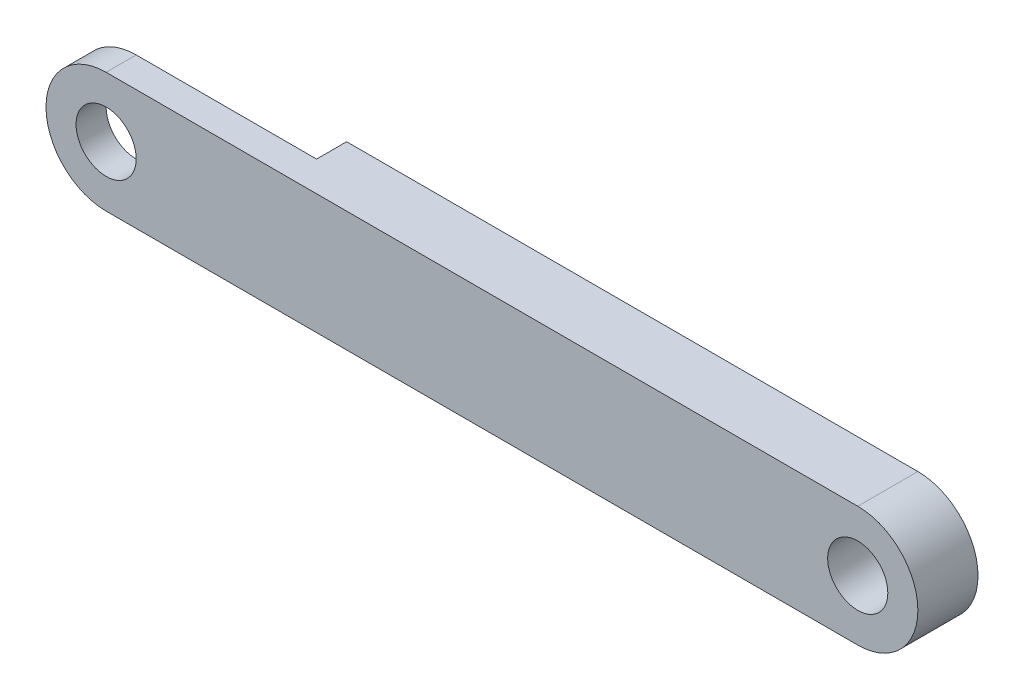
ISO-10303-21;
HEADER;
FILE_DESCRIPTION(('STEP AP214'),'2;1');
FILE_NAME('part.step','',(''),(''),'','','');
FILE_SCHEMA(('AUTOMOTIVE_DESIGN { 1 0 10303 214 1 1 1 1 }'));
ENDSEC;
DATA;
#1=APPLICATION_CONTEXT('core data for automotive mechanical design processes');
#2=APPLICATION_PROTOCOL_DEFINITION('international standard','automotive_design',2000,#1);
#3=PRODUCT_CONTEXT('',#1,'mechanical');
#4=PRODUCT('Part','Part','',(#3));
#5=PRODUCT_RELATED_PRODUCT_CATEGORY('part','',(#4));
#6=PRODUCT_DEFINITION_FORMATION('','',#4);
#7=PRODUCT_DEFINITION_CONTEXT('part definition',#1,'design');
#8=PRODUCT_DEFINITION('design','',#6,#7);
#9=PRODUCT_DEFINITION_SHAPE('','',#8);
#10=(LENGTH_UNIT() NAMED_UNIT(*) SI_UNIT(.MILLI.,.METRE.));
#11=(NAMED_UNIT(*) PLANE_ANGLE_UNIT() SI_UNIT($,.RADIAN.));
#12=(NAMED_UNIT(*) SI_UNIT($,.STERADIAN.) SOLID_ANGLE_UNIT());
#13=UNCERTAINTY_MEASURE_WITH_UNIT(LENGTH_MEASURE(1.E-05),#10,'distance_accuracy_value','');
#14=(GEOMETRIC_REPRESENTATION_CONTEXT(3) GLOBAL_UNCERTAINTY_ASSIGNED_CONTEXT((#13)) GLOBAL_UNIT_ASSIGNED_CONTEXT((#10,
#11,#12)) REPRESENTATION_CONTEXT('',''));
#15=CARTESIAN_POINT('',(0.,0.,0.));
#16=DIRECTION('',(0.,0.,1.));
#17=DIRECTION('',(1.,0.,0.));
#18=AXIS2_PLACEMENT_3D('',#15,#16,#17);
#19=CARTESIAN_POINT('',(0.,0.,5.));
#20=DIRECTION('',(0.,0.,-1.));
#21=DIRECTION('',(-1.,0.,0.));
#22=AXIS2_PLACEMENT_3D('',#19,#20,#21);
#23=CYLINDRICAL_SURFACE('',#22,10.);
#24=CARTESIAN_POINT('',(0.,0.,0.));
#25=DIRECTION('',(0.,0.,-1.));
#26=DIRECTION('',(-1.,0.,0.));
#27=AXIS2_PLACEMENT_3D('',#24,#25,#26);
#28=CIRCLE('',#27,10.);
#29=CARTESIAN_POINT('',(0.,-10.,0.));
#30=VERTEX_POINT('',#29);
#31=CARTESIAN_POINT('',(0.,10.,0.));
#32=VERTEX_POINT('',#31);
#33=EDGE_CURVE('E48',#30,#32,#28,.T.);
#34=ORIENTED_EDGE('',*,*,#33,.F.);
#35=DIRECTION('',(0.,0.,-1.));
#36=VECTOR('',#35,1.);
#37=CARTESIAN_POINT('',(0.,-10.,5.));
#38=LINE('',#37,#36);
#39=CARTESIAN_POINT('',(0.,-10.,5.));
#40=VERTEX_POINT('',#39);
#41=EDGE_CURVE('E11',#40,#30,#38,.T.);
#42=ORIENTED_EDGE('',*,*,#41,.F.);
#43=CARTESIAN_POINT('',(0.,0.,5.));
#44=DIRECTION('',(0.,0.,1.));
#45=DIRECTION('',(1.,0.,0.));
#46=AXIS2_PLACEMENT_3D('',#43,#44,#45);
#47=CIRCLE('',#46,10.);
#48=CARTESIAN_POINT('',(0.,10.,5.));
#49=VERTEX_POINT('',#48);
#50=EDGE_CURVE('E118',#49,#40,#47,.T.);
#51=ORIENTED_EDGE('',*,*,#50,.F.);
#52=DIRECTION('',(0.,0.,-1.));
#53=VECTOR('',#52,1.);
#54=CARTESIAN_POINT('',(0.,10.,5.));
#55=LINE('',#54,#53);
#56=EDGE_CURVE('E124',#49,#32,#55,.T.);
#57=ORIENTED_EDGE('',*,*,#56,.T.);
#58=EDGE_LOOP('',(#34,#42,#51,#57));
#59=FACE_BOUND('',#58,.T.);
#60=ADVANCED_FACE('F33',(#59),#23,.T.);
#61=CARTESIAN_POINT('',(0.,0.,5.));
#62=DIRECTION('',(0.,0.,-1.));
#63=DIRECTION('',(-1.,0.,0.));
#64=AXIS2_PLACEMENT_3D('',#61,#62,#63);
#65=CYLINDRICAL_SURFACE('',#64,5.);
#66=CARTESIAN_POINT('',(0.,0.,5.));
#67=DIRECTION('',(0.,0.,1.));
#68=DIRECTION('',(1.,0.,0.));
#69=AXIS2_PLACEMENT_3D('',#66,#67,#68);
#70=CIRCLE('',#69,5.);
#71=CARTESIAN_POINT('',(5.,0.,5.));
#72=VERTEX_POINT('',#71);
#73=EDGE_CURVE('E133',#72,#72,#70,.T.);
#74=ORIENTED_EDGE('',*,*,#73,.T.);
#75=EDGE_LOOP('',(#74));
#76=FACE_BOUND('',#75,.T.);
#77=CARTESIAN_POINT('',(0.,0.,0.));
#78=DIRECTION('',(0.,0.,-1.));
#79=DIRECTION('',(-1.,0.,0.));
#80=AXIS2_PLACEMENT_3D('',#77,#78,#79);
#81=CIRCLE('',#80,5.);
#82=CARTESIAN_POINT('',(-5.,0.,0.));
#83=VERTEX_POINT('',#82);
#84=EDGE_CURVE('E36',#83,#83,#81,.T.);
#85=ORIENTED_EDGE('',*,*,#84,.T.);
#86=EDGE_LOOP('',(#85));
#87=FACE_BOUND('',#86,.T.);
#88=ADVANCED_FACE('F157',(#76,#87),#65,.F.);
#89=CARTESIAN_POINT('',(0.,0.,5.));
#90=DIRECTION('',(0.,0.,1.));
#91=DIRECTION('',(1.,0.,0.));
#92=AXIS2_PLACEMENT_3D('',#89,#90,#91);
#93=PLANE('',#92);
#94=ORIENTED_EDGE('',*,*,#73,.F.);
#95=EDGE_LOOP('',(#94));
#96=FACE_BOUND('',#95,.T.);
#97=ORIENTED_EDGE('',*,*,#50,.T.);
#98=DIRECTION('',(1.,0.,0.));
#99=VECTOR('',#98,1.);
#100=CARTESIAN_POINT('',(0.,-10.,5.));
#101=LINE('',#100,#99);
#102=CARTESIAN_POINT('',(125.,-10.,5.));
#103=VERTEX_POINT('',#102);
#104=EDGE_CURVE('E80',#40,#103,#101,.T.);
#105=ORIENTED_EDGE('',*,*,#104,.T.);
#106=CARTESIAN_POINT('',(125.,0.,5.));
#107=DIRECTION('',(0.,0.,1.));
#108=DIRECTION('',(1.,0.,0.));
#109=AXIS2_PLACEMENT_3D('',#106,#107,#108);
#110=CIRCLE('',#109,10.);
#111=CARTESIAN_POINT('',(125.,10.,5.));
#112=VERTEX_POINT('',#111);
#113=EDGE_CURVE('E130',#103,#112,#110,.T.);
#114=ORIENTED_EDGE('',*,*,#113,.T.);
#115=DIRECTION('',(-1.,0.,0.));
#116=VECTOR('',#115,1.);
#117=CARTESIAN_POINT('',(0.,10.,5.));
#118=LINE('',#117,#116);
#119=EDGE_CURVE('E57',#112,#49,#118,.T.);
#120=ORIENTED_EDGE('',*,*,#119,.T.);
#121=EDGE_LOOP('',(#97,#105,#114,#120));
#122=FACE_BOUND('',#121,.T.);
#123=CARTESIAN_POINT('',(125.,0.,5.));
#124=DIRECTION('',(0.,0.,1.));
#125=DIRECTION('',(1.,0.,0.));
#126=AXIS2_PLACEMENT_3D('',#123,#124,#125);
#127=CIRCLE('',#126,4.99999999999999);
#128=CARTESIAN_POINT('',(130.,0.,5.));
#129=VERTEX_POINT('',#128);
#130=EDGE_CURVE('E135',#129,#129,#127,.T.);
#131=ORIENTED_EDGE('',*,*,#130,.F.);
#132=EDGE_LOOP('',(#131));
#133=FACE_BOUND('',#132,.T.);
#134=ADVANCED_FACE('F154',(#96,#122,#133),#93,.T.);
#135=CARTESIAN_POINT('',(0.,0.,-5.));
#136=DIRECTION('',(0.,0.,1.));
#137=DIRECTION('',(1.,0.,0.));
#138=AXIS2_PLACEMENT_3D('',#135,#136,#137);
#139=PLANE('',#138);
#140=DIRECTION('',(1.,0.,0.));
#141=VECTOR('',#140,1.);
#142=CARTESIAN_POINT('',(0.,-10.,-5.));
#143=LINE('',#142,#141);
#144=CARTESIAN_POINT('',(30.,-10.,-5.));
#145=VERTEX_POINT('',#144);
#146=CARTESIAN_POINT('',(125.,-10.,-5.));
#147=VERTEX_POINT('',#146);
#148=EDGE_CURVE('E113',#145,#147,#143,.T.);
#149=ORIENTED_EDGE('',*,*,#148,.F.);
#150=DIRECTION('',(0.,1.,0.));
#151=VECTOR('',#150,1.);
#152=CARTESIAN_POINT('',(30.,-10.,-5.));
#153=LINE('',#152,#151);
#154=CARTESIAN_POINT('',(30.,10.,-5.));
#155=VERTEX_POINT('',#154);
#156=EDGE_CURVE('E99',#145,#155,#153,.T.);
#157=ORIENTED_EDGE('',*,*,#156,.T.);
#158=DIRECTION('',(-1.,0.,0.));
#159=VECTOR('',#158,1.);
#160=CARTESIAN_POINT('',(0.,10.,-5.));
#161=LINE('',#160,#159);
#162=CARTESIAN_POINT('',(125.,10.,-5.));
#163=VERTEX_POINT('',#162);
#164=EDGE_CURVE('E112',#163,#155,#161,.T.);
#165=ORIENTED_EDGE('',*,*,#164,.F.);
#166=CARTESIAN_POINT('',(125.,0.,-5.));
#167=DIRECTION('',(0.,0.,1.));
#168=DIRECTION('',(1.,0.,0.));
#169=AXIS2_PLACEMENT_3D('',#166,#167,#168);
#170=CIRCLE('',#169,10.);
#171=EDGE_CURVE('E73',#147,#163,#170,.T.);
#172=ORIENTED_EDGE('',*,*,#171,.F.);
#173=EDGE_LOOP('',(#149,#157,#165,#172));
#174=FACE_BOUND('',#173,.T.);
#175=CARTESIAN_POINT('',(125.,0.,-5.));
#176=DIRECTION('',(0.,0.,1.));
#177=DIRECTION('',(1.,0.,0.));
#178=AXIS2_PLACEMENT_3D('',#175,#176,#177);
#179=CIRCLE('',#178,4.99999999999999);
#180=CARTESIAN_POINT('',(130.,0.,-5.));
#181=VERTEX_POINT('',#180);
#182=EDGE_CURVE('E141',#181,#181,#179,.T.);
#183=ORIENTED_EDGE('',*,*,#182,.T.);
#184=EDGE_LOOP('',(#183));
#185=FACE_BOUND('',#184,.T.);
#186=ADVANCED_FACE('F110',(#174,#185),#139,.F.);
#187=CARTESIAN_POINT('',(0.,-10.,5.));
#188=DIRECTION('',(0.,1.,0.));
#189=DIRECTION('',(0.,0.,1.));
#190=AXIS2_PLACEMENT_3D('',#187,#188,#189);
#191=PLANE('',#190);
#192=DIRECTION('',(1.,0.,0.));
#193=VECTOR('',#192,1.);
#194=CARTESIAN_POINT('',(-29.402785504456,-10.,0.));
#195=LINE('',#194,#193);
#196=CARTESIAN_POINT('',(30.,-10.,0.));
#197=VERTEX_POINT('',#196);
#198=EDGE_CURVE('E114',#30,#197,#195,.T.);
#199=ORIENTED_EDGE('',*,*,#198,.T.);
#200=DIRECTION('',(0.,0.,1.));
#201=VECTOR('',#200,1.);
#202=CARTESIAN_POINT('',(30.,-10.,-5.));
#203=LINE('',#202,#201);
#204=EDGE_CURVE('E105',#145,#197,#203,.T.);
#205=ORIENTED_EDGE('',*,*,#204,.F.);
#206=ORIENTED_EDGE('',*,*,#148,.T.);
#207=DIRECTION('',(0.,0.,-1.));
#208=VECTOR('',#207,1.);
#209=CARTESIAN_POINT('',(125.,-10.,5.));
#210=LINE('',#209,#208);
#211=EDGE_CURVE('E41',#103,#147,#210,.T.);
#212=ORIENTED_EDGE('',*,*,#211,.F.);
#213=ORIENTED_EDGE('',*,*,#104,.F.);
#214=ORIENTED_EDGE('',*,*,#41,.T.);
#215=EDGE_LOOP('',(#199,#205,#206,#212,#213,#214));
#216=FACE_BOUND('',#215,.T.);
#217=ADVANCED_FACE('F132',(#216),#191,.F.);
#218=CARTESIAN_POINT('',(125.,0.,5.));
#219=DIRECTION('',(0.,0.,-1.));
#220=DIRECTION('',(-1.,0.,0.));
#221=AXIS2_PLACEMENT_3D('',#218,#219,#220);
#222=CYLINDRICAL_SURFACE('',#221,10.);
#223=ORIENTED_EDGE('',*,*,#171,.T.);
#224=DIRECTION('',(0.,0.,-1.));
#225=VECTOR('',#224,1.);
#226=CARTESIAN_POINT('',(125.,10.,5.));
#227=LINE('',#226,#225);
#228=EDGE_CURVE('E117',#112,#163,#227,.T.);
#229=ORIENTED_EDGE('',*,*,#228,.F.);
#230=ORIENTED_EDGE('',*,*,#113,.F.);
#231=ORIENTED_EDGE('',*,*,#211,.T.);
#232=EDGE_LOOP('',(#223,#229,#230,#231));
#233=FACE_BOUND('',#232,.T.);
#234=ADVANCED_FACE('F129',(#233),#222,.T.);
#235=CARTESIAN_POINT('',(0.,10.,5.));
#236=DIRECTION('',(0.,-1.,0.));
#237=DIRECTION('',(0.,0.,-1.));
#238=AXIS2_PLACEMENT_3D('',#235,#236,#237);
#239=PLANE('',#238);
#240=ORIENTED_EDGE('',*,*,#164,.T.);
#241=DIRECTION('',(0.,0.,1.));
#242=VECTOR('',#241,1.);
#243=CARTESIAN_POINT('',(30.,10.,-5.));
#244=LINE('',#243,#242);
#245=CARTESIAN_POINT('',(30.,10.,0.));
#246=VERTEX_POINT('',#245);
#247=EDGE_CURVE('E96',#155,#246,#244,.T.);
#248=ORIENTED_EDGE('',*,*,#247,.T.);
#249=DIRECTION('',(-1.,0.,0.));
#250=VECTOR('',#249,1.);
#251=CARTESIAN_POINT('',(-29.402785504456,10.,0.));
#252=LINE('',#251,#250);
#253=EDGE_CURVE('E149',#246,#32,#252,.T.);
#254=ORIENTED_EDGE('',*,*,#253,.T.);
#255=ORIENTED_EDGE('',*,*,#56,.F.);
#256=ORIENTED_EDGE('',*,*,#119,.F.);
#257=ORIENTED_EDGE('',*,*,#228,.T.);
#258=EDGE_LOOP('',(#240,#248,#254,#255,#256,#257));
#259=FACE_BOUND('',#258,.T.);
#260=ADVANCED_FACE('F116',(#259),#239,.F.);
#261=CARTESIAN_POINT('',(125.,0.,5.));
#262=DIRECTION('',(0.,0.,-1.));
#263=DIRECTION('',(-1.,0.,0.));
#264=AXIS2_PLACEMENT_3D('',#261,#262,#263);
#265=CYLINDRICAL_SURFACE('',#264,4.99999999999999);
#266=ORIENTED_EDGE('',*,*,#130,.T.);
#267=EDGE_LOOP('',(#266));
#268=FACE_BOUND('',#267,.T.);
#269=ORIENTED_EDGE('',*,*,#182,.F.);
#270=EDGE_LOOP('',(#269));
#271=FACE_BOUND('',#270,.T.);
#272=ADVANCED_FACE('F162',(#268,#271),#265,.F.);
#273=CARTESIAN_POINT('',(0.,0.,0.));
#274=DIRECTION('',(0.,0.,-1.));
#275=DIRECTION('',(-1.,0.,0.));
#276=AXIS2_PLACEMENT_3D('',#273,#274,#275);
#277=PLANE('',#276);
#278=ORIENTED_EDGE('',*,*,#84,.F.);
#279=EDGE_LOOP('',(#278));
#280=FACE_BOUND('',#279,.T.);
#281=ORIENTED_EDGE('',*,*,#33,.T.);
#282=ORIENTED_EDGE('',*,*,#253,.F.);
#283=DIRECTION('',(0.,1.,0.));
#284=VECTOR('',#283,1.);
#285=CARTESIAN_POINT('',(30.,-10.,0.));
#286=LINE('',#285,#284);
#287=EDGE_CURVE('E102',#197,#246,#286,.T.);
#288=ORIENTED_EDGE('',*,*,#287,.F.);
#289=ORIENTED_EDGE('',*,*,#198,.F.);
#290=EDGE_LOOP('',(#281,#282,#288,#289));
#291=FACE_BOUND('',#290,.T.);
#292=ADVANCED_FACE('F165',(#280,#291),#277,.T.);
#293=CARTESIAN_POINT('',(30.,-10.,-5.));
#294=DIRECTION('',(1.,0.,0.));
#295=DIRECTION('',(0.,0.,-1.));
#296=AXIS2_PLACEMENT_3D('',#293,#294,#295);
#297=PLANE('',#296);
#298=ORIENTED_EDGE('',*,*,#287,.T.);
#299=ORIENTED_EDGE('',*,*,#247,.F.);
#300=ORIENTED_EDGE('',*,*,#156,.F.);
#301=ORIENTED_EDGE('',*,*,#204,.T.);
#302=EDGE_LOOP('',(#298,#299,#300,#301));
#303=FACE_BOUND('',#302,.T.);
#304=ADVANCED_FACE('F98',(#303),#297,.F.);
#305=CLOSED_SHELL('',(#60,#88,#134,#186,#217,#234,#260,#272,#292,#304));
#306=MANIFOLD_SOLID_BREP('B2',#305);
#307=ADVANCED_BREP_SHAPE_REPRESENTATION('',(#18,#306),#14);
#308=SHAPE_DEFINITION_REPRESENTATION(#9,#307);
ENDSEC;
END-ISO-10303-21;
